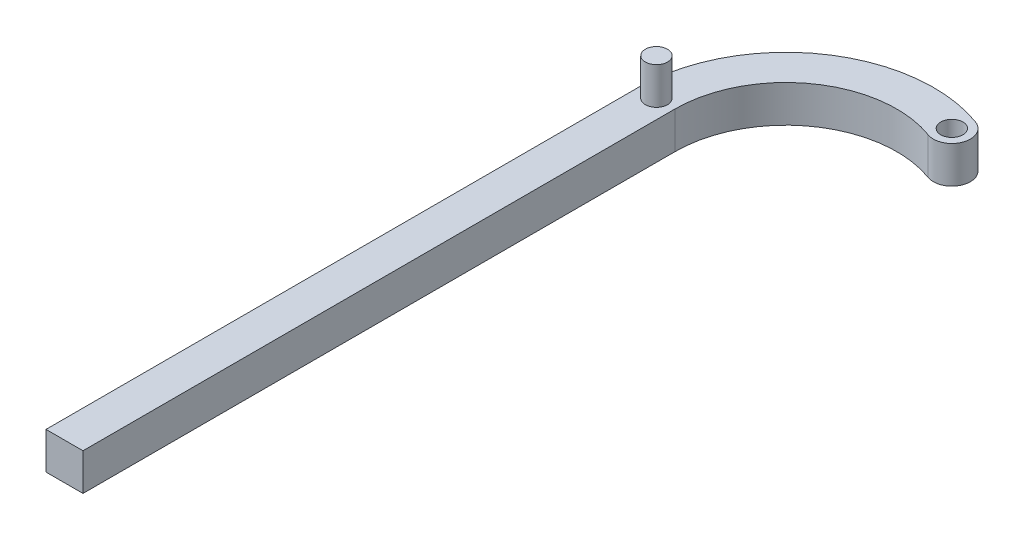
ISO-10303-21;
HEADER;
FILE_DESCRIPTION(('STEP AP214'),'2;1');
FILE_NAME('part.step','',(''),(''),'','','');
FILE_SCHEMA(('AUTOMOTIVE_DESIGN { 1 0 10303 214 1 1 1 1 }'));
ENDSEC;
DATA;
#1=APPLICATION_CONTEXT('core data for automotive mechanical design processes');
#2=APPLICATION_PROTOCOL_DEFINITION('international standard','automotive_design',2000,#1);
#3=PRODUCT_CONTEXT('',#1,'mechanical');
#4=PRODUCT('Part','Part','',(#3));
#5=PRODUCT_RELATED_PRODUCT_CATEGORY('part','',(#4));
#6=PRODUCT_DEFINITION_FORMATION('','',#4);
#7=PRODUCT_DEFINITION_CONTEXT('part definition',#1,'design');
#8=PRODUCT_DEFINITION('design','',#6,#7);
#9=PRODUCT_DEFINITION_SHAPE('','',#8);
#10=(LENGTH_UNIT() NAMED_UNIT(*) SI_UNIT(.MILLI.,.METRE.));
#11=(NAMED_UNIT(*) PLANE_ANGLE_UNIT() SI_UNIT($,.RADIAN.));
#12=(NAMED_UNIT(*) SI_UNIT($,.STERADIAN.) SOLID_ANGLE_UNIT());
#13=UNCERTAINTY_MEASURE_WITH_UNIT(LENGTH_MEASURE(1.E-05),#10,'distance_accuracy_value','');
#14=(GEOMETRIC_REPRESENTATION_CONTEXT(3) GLOBAL_UNCERTAINTY_ASSIGNED_CONTEXT((#13)) GLOBAL_UNIT_ASSIGNED_CONTEXT((#10,
#11,#12)) REPRESENTATION_CONTEXT('',''));
#15=CARTESIAN_POINT('',(0.,0.,0.));
#16=DIRECTION('',(0.,0.,1.));
#17=DIRECTION('',(1.,0.,0.));
#18=AXIS2_PLACEMENT_3D('',#15,#16,#17);
#19=CARTESIAN_POINT('',(0.,5.,0.));
#20=DIRECTION('',(0.,1.,0.));
#21=DIRECTION('',(0.,0.,1.));
#22=AXIS2_PLACEMENT_3D('',#19,#20,#21);
#23=PLANE('',#22);
#24=CARTESIAN_POINT('',(0.,5.,0.));
#25=DIRECTION('',(0.,1.,0.));
#26=DIRECTION('',(0.,0.,1.));
#27=AXIS2_PLACEMENT_3D('',#24,#25,#26);
#28=CIRCLE('',#27,15.);
#29=CARTESIAN_POINT('',(5.13030214988509,5.,-14.0953893117886));
#30=VERTEX_POINT('',#29);
#31=CARTESIAN_POINT('',(-15.,5.,0.));
#32=VERTEX_POINT('',#31);
#33=EDGE_CURVE('E89',#30,#32,#28,.T.);
#34=ORIENTED_EDGE('',*,*,#33,.F.);
#35=CARTESIAN_POINT('',(5.98535250819927,5.,-16.4446208637534));
#36=DIRECTION('',(0.,1.,0.));
#37=DIRECTION('',(0.,0.,1.));
#38=AXIS2_PLACEMENT_3D('',#35,#36,#37);
#39=CIRCLE('',#38,2.5);
#40=CARTESIAN_POINT('',(6.84040286651345,5.,-18.7938524157181));
#41=VERTEX_POINT('',#40);
#42=EDGE_CURVE('E92',#30,#41,#39,.T.);
#43=ORIENTED_EDGE('',*,*,#42,.T.);
#44=CARTESIAN_POINT('',(0.,5.,0.));
#45=DIRECTION('',(0.,1.,0.));
#46=DIRECTION('',(0.,0.,1.));
#47=AXIS2_PLACEMENT_3D('',#44,#45,#46);
#48=CIRCLE('',#47,20.);
#49=CARTESIAN_POINT('',(-20.,5.,0.));
#50=VERTEX_POINT('',#49);
#51=EDGE_CURVE('E11',#41,#50,#48,.T.);
#52=ORIENTED_EDGE('',*,*,#51,.T.);
#53=DIRECTION('',(0.,0.,-1.));
#54=VECTOR('',#53,1.);
#55=CARTESIAN_POINT('',(-20.,5.,80.));
#56=LINE('',#55,#54);
#57=CARTESIAN_POINT('',(-20.,5.,80.));
#58=VERTEX_POINT('',#57);
#59=EDGE_CURVE('E124',#58,#50,#56,.T.);
#60=ORIENTED_EDGE('',*,*,#59,.F.);
#61=DIRECTION('',(-1.,0.,0.));
#62=VECTOR('',#61,1.);
#63=CARTESIAN_POINT('',(-15.,5.,80.));
#64=LINE('',#63,#62);
#65=CARTESIAN_POINT('',(-15.,5.,80.));
#66=VERTEX_POINT('',#65);
#67=EDGE_CURVE('E107',#66,#58,#64,.T.);
#68=ORIENTED_EDGE('',*,*,#67,.F.);
#69=DIRECTION('',(0.,0.,1.));
#70=VECTOR('',#69,1.);
#71=CARTESIAN_POINT('',(-15.,5.,0.));
#72=LINE('',#71,#70);
#73=EDGE_CURVE('E94',#32,#66,#72,.T.);
#74=ORIENTED_EDGE('',*,*,#73,.F.);
#75=EDGE_LOOP('',(#34,#43,#52,#60,#68,#74));
#76=FACE_BOUND('',#75,.T.);
#77=CARTESIAN_POINT('',(5.98535250819927,5.,-16.4446208637534));
#78=DIRECTION('',(0.,1.,0.));
#79=DIRECTION('',(0.,0.,1.));
#80=AXIS2_PLACEMENT_3D('',#77,#78,#79);
#81=CIRCLE('',#80,1.5);
#82=CARTESIAN_POINT('',(5.98535250819927,5.,-14.9446208637534));
#83=VERTEX_POINT('',#82);
#84=EDGE_CURVE('E110',#83,#83,#81,.T.);
#85=ORIENTED_EDGE('',*,*,#84,.F.);
#86=EDGE_LOOP('',(#85));
#87=FACE_BOUND('',#86,.T.);
#88=CARTESIAN_POINT('',(-17.5,5.,0.));
#89=DIRECTION('',(0.,1.,0.));
#90=DIRECTION('',(0.,0.,1.));
#91=AXIS2_PLACEMENT_3D('',#88,#89,#90);
#92=CIRCLE('',#91,1.5);
#93=CARTESIAN_POINT('',(-17.5,5.,1.5));
#94=VERTEX_POINT('',#93);
#95=EDGE_CURVE('E186',#94,#94,#92,.T.);
#96=ORIENTED_EDGE('',*,*,#95,.F.);
#97=EDGE_LOOP('',(#96));
#98=FACE_BOUND('',#97,.T.);
#99=ADVANCED_FACE('F33',(#76,#87,#98),#23,.T.);
#100=CARTESIAN_POINT('',(0.,5.,0.));
#101=DIRECTION('',(0.,-1.,0.));
#102=DIRECTION('',(0.,0.,-1.));
#103=AXIS2_PLACEMENT_3D('',#100,#101,#102);
#104=CYLINDRICAL_SURFACE('',#103,20.);
#105=ORIENTED_EDGE('',*,*,#51,.F.);
#106=DIRECTION('',(0.,1.,0.));
#107=VECTOR('',#106,1.);
#108=CARTESIAN_POINT('',(6.84040286651345,0.,-18.7938524157181));
#109=LINE('',#108,#107);
#110=CARTESIAN_POINT('',(6.84040286651345,0.,-18.7938524157181));
#111=VERTEX_POINT('',#110);
#112=EDGE_CURVE('E101',#111,#41,#109,.T.);
#113=ORIENTED_EDGE('',*,*,#112,.F.);
#114=CARTESIAN_POINT('',(0.,0.,0.));
#115=DIRECTION('',(0.,1.,0.));
#116=DIRECTION('',(0.,0.,1.));
#117=AXIS2_PLACEMENT_3D('',#114,#115,#116);
#118=CIRCLE('',#117,20.);
#119=CARTESIAN_POINT('',(-20.,0.,0.));
#120=VERTEX_POINT('',#119);
#121=EDGE_CURVE('E37',#111,#120,#118,.T.);
#122=ORIENTED_EDGE('',*,*,#121,.T.);
#123=DIRECTION('',(0.,1.,0.));
#124=VECTOR('',#123,1.);
#125=CARTESIAN_POINT('',(-20.,0.,0.));
#126=LINE('',#125,#124);
#127=EDGE_CURVE('E134',#120,#50,#126,.T.);
#128=ORIENTED_EDGE('',*,*,#127,.T.);
#129=EDGE_LOOP('',(#105,#113,#122,#128));
#130=FACE_BOUND('',#129,.T.);
#131=ADVANCED_FACE('F35',(#130),#104,.T.);
#132=CARTESIAN_POINT('',(0.,0.,0.));
#133=DIRECTION('',(0.,1.,0.));
#134=DIRECTION('',(0.,0.,1.));
#135=AXIS2_PLACEMENT_3D('',#132,#133,#134);
#136=PLANE('',#135);
#137=CARTESIAN_POINT('',(5.98535250819927,0.,-16.4446208637534));
#138=DIRECTION('',(0.,1.,0.));
#139=DIRECTION('',(0.,0.,1.));
#140=AXIS2_PLACEMENT_3D('',#137,#138,#139);
#141=CIRCLE('',#140,1.5);
#142=CARTESIAN_POINT('',(5.98535250819927,0.,-14.9446208637534));
#143=VERTEX_POINT('',#142);
#144=EDGE_CURVE('E105',#143,#143,#141,.T.);
#145=ORIENTED_EDGE('',*,*,#144,.T.);
#146=EDGE_LOOP('',(#145));
#147=FACE_BOUND('',#146,.T.);
#148=ORIENTED_EDGE('',*,*,#121,.F.);
#149=CARTESIAN_POINT('',(5.98535250819927,0.,-16.4446208637534));
#150=DIRECTION('',(0.,1.,0.));
#151=DIRECTION('',(0.,0.,1.));
#152=AXIS2_PLACEMENT_3D('',#149,#150,#151);
#153=CIRCLE('',#152,2.5);
#154=CARTESIAN_POINT('',(5.13030214988509,0.,-14.0953893117886));
#155=VERTEX_POINT('',#154);
#156=EDGE_CURVE('E104',#155,#111,#153,.T.);
#157=ORIENTED_EDGE('',*,*,#156,.F.);
#158=CARTESIAN_POINT('',(0.,0.,0.));
#159=DIRECTION('',(0.,1.,0.));
#160=DIRECTION('',(0.,0.,1.));
#161=AXIS2_PLACEMENT_3D('',#158,#159,#160);
#162=CIRCLE('',#161,15.);
#163=CARTESIAN_POINT('',(-15.,0.,0.));
#164=VERTEX_POINT('',#163);
#165=EDGE_CURVE('E53',#155,#164,#162,.T.);
#166=ORIENTED_EDGE('',*,*,#165,.T.);
#167=DIRECTION('',(0.,0.,1.));
#168=VECTOR('',#167,1.);
#169=CARTESIAN_POINT('',(-15.,0.,0.));
#170=LINE('',#169,#168);
#171=CARTESIAN_POINT('',(-15.,0.,80.));
#172=VERTEX_POINT('',#171);
#173=EDGE_CURVE('E119',#164,#172,#170,.T.);
#174=ORIENTED_EDGE('',*,*,#173,.T.);
#175=DIRECTION('',(-1.,0.,0.));
#176=VECTOR('',#175,1.);
#177=CARTESIAN_POINT('',(-15.,0.,80.));
#178=LINE('',#177,#176);
#179=CARTESIAN_POINT('',(-20.,0.,80.));
#180=VERTEX_POINT('',#179);
#181=EDGE_CURVE('E114',#172,#180,#178,.T.);
#182=ORIENTED_EDGE('',*,*,#181,.T.);
#183=DIRECTION('',(0.,0.,-1.));
#184=VECTOR('',#183,1.);
#185=CARTESIAN_POINT('',(-20.,0.,80.));
#186=LINE('',#185,#184);
#187=EDGE_CURVE('E117',#180,#120,#186,.T.);
#188=ORIENTED_EDGE('',*,*,#187,.T.);
#189=EDGE_LOOP('',(#148,#157,#166,#174,#182,#188));
#190=FACE_BOUND('',#189,.T.);
#191=ADVANCED_FACE('F139',(#147,#190),#136,.F.);
#192=CARTESIAN_POINT('',(0.,0.,0.));
#193=DIRECTION('',(0.,1.,0.));
#194=DIRECTION('',(0.,0.,1.));
#195=AXIS2_PLACEMENT_3D('',#192,#193,#194);
#196=CYLINDRICAL_SURFACE('',#195,15.);
#197=ORIENTED_EDGE('',*,*,#165,.F.);
#198=DIRECTION('',(0.,1.,0.));
#199=VECTOR('',#198,1.);
#200=CARTESIAN_POINT('',(5.13030214988509,0.,-14.0953893117886));
#201=LINE('',#200,#199);
#202=EDGE_CURVE('E95',#155,#30,#201,.T.);
#203=ORIENTED_EDGE('',*,*,#202,.T.);
#204=ORIENTED_EDGE('',*,*,#33,.T.);
#205=DIRECTION('',(0.,1.,0.));
#206=VECTOR('',#205,1.);
#207=CARTESIAN_POINT('',(-15.,0.,0.));
#208=LINE('',#207,#206);
#209=EDGE_CURVE('E48',#164,#32,#208,.T.);
#210=ORIENTED_EDGE('',*,*,#209,.F.);
#211=EDGE_LOOP('',(#197,#203,#204,#210));
#212=FACE_BOUND('',#211,.T.);
#213=ADVANCED_FACE('F97',(#212),#196,.F.);
#214=CARTESIAN_POINT('',(-15.,0.,80.));
#215=DIRECTION('',(0.,0.,-1.));
#216=DIRECTION('',(-1.,0.,0.));
#217=AXIS2_PLACEMENT_3D('',#214,#215,#216);
#218=PLANE('',#217);
#219=ORIENTED_EDGE('',*,*,#67,.T.);
#220=DIRECTION('',(0.,1.,0.));
#221=VECTOR('',#220,1.);
#222=CARTESIAN_POINT('',(-20.,0.,80.));
#223=LINE('',#222,#221);
#224=EDGE_CURVE('E130',#180,#58,#223,.T.);
#225=ORIENTED_EDGE('',*,*,#224,.F.);
#226=ORIENTED_EDGE('',*,*,#181,.F.);
#227=DIRECTION('',(0.,1.,0.));
#228=VECTOR('',#227,1.);
#229=CARTESIAN_POINT('',(-15.,0.,80.));
#230=LINE('',#229,#228);
#231=EDGE_CURVE('E121',#172,#66,#230,.T.);
#232=ORIENTED_EDGE('',*,*,#231,.T.);
#233=EDGE_LOOP('',(#219,#225,#226,#232));
#234=FACE_BOUND('',#233,.T.);
#235=ADVANCED_FACE('F146',(#234),#218,.F.);
#236=CARTESIAN_POINT('',(-20.,0.,80.));
#237=DIRECTION('',(1.,0.,0.));
#238=DIRECTION('',(0.,0.,-1.));
#239=AXIS2_PLACEMENT_3D('',#236,#237,#238);
#240=PLANE('',#239);
#241=ORIENTED_EDGE('',*,*,#59,.T.);
#242=ORIENTED_EDGE('',*,*,#127,.F.);
#243=ORIENTED_EDGE('',*,*,#187,.F.);
#244=ORIENTED_EDGE('',*,*,#224,.T.);
#245=EDGE_LOOP('',(#241,#242,#243,#244));
#246=FACE_BOUND('',#245,.T.);
#247=ADVANCED_FACE('F149',(#246),#240,.F.);
#248=CARTESIAN_POINT('',(-15.,0.,0.));
#249=DIRECTION('',(-1.,0.,0.));
#250=DIRECTION('',(0.,0.,1.));
#251=AXIS2_PLACEMENT_3D('',#248,#249,#250);
#252=PLANE('',#251);
#253=ORIENTED_EDGE('',*,*,#73,.T.);
#254=ORIENTED_EDGE('',*,*,#231,.F.);
#255=ORIENTED_EDGE('',*,*,#173,.F.);
#256=ORIENTED_EDGE('',*,*,#209,.T.);
#257=EDGE_LOOP('',(#253,#254,#255,#256));
#258=FACE_BOUND('',#257,.T.);
#259=ADVANCED_FACE('F142',(#258),#252,.F.);
#260=CARTESIAN_POINT('',(5.98535250819927,0.,-16.4446208637534));
#261=DIRECTION('',(0.,1.,0.));
#262=DIRECTION('',(0.,0.,1.));
#263=AXIS2_PLACEMENT_3D('',#260,#261,#262);
#264=CYLINDRICAL_SURFACE('',#263,2.5);
#265=ORIENTED_EDGE('',*,*,#42,.F.);
#266=ORIENTED_EDGE('',*,*,#202,.F.);
#267=ORIENTED_EDGE('',*,*,#156,.T.);
#268=ORIENTED_EDGE('',*,*,#112,.T.);
#269=EDGE_LOOP('',(#265,#266,#267,#268));
#270=FACE_BOUND('',#269,.T.);
#271=ADVANCED_FACE('F103',(#270),#264,.T.);
#272=CARTESIAN_POINT('',(5.98535250819927,0.,-16.4446208637534));
#273=DIRECTION('',(0.,1.,0.));
#274=DIRECTION('',(0.,0.,1.));
#275=AXIS2_PLACEMENT_3D('',#272,#273,#274);
#276=CYLINDRICAL_SURFACE('',#275,1.5);
#277=ORIENTED_EDGE('',*,*,#144,.F.);
#278=EDGE_LOOP('',(#277));
#279=FACE_BOUND('',#278,.T.);
#280=ORIENTED_EDGE('',*,*,#84,.T.);
#281=EDGE_LOOP('',(#280));
#282=FACE_BOUND('',#281,.T.);
#283=ADVANCED_FACE('F170',(#279,#282),#276,.F.);
#284=CARTESIAN_POINT('',(-17.5,10.,0.));
#285=DIRECTION('',(0.,-1.,0.));
#286=DIRECTION('',(0.,0.,-1.));
#287=AXIS2_PLACEMENT_3D('',#284,#285,#286);
#288=CYLINDRICAL_SURFACE('',#287,1.5);
#289=CARTESIAN_POINT('',(-17.5,10.,0.));
#290=DIRECTION('',(0.,1.,0.));
#291=DIRECTION('',(0.,0.,1.));
#292=AXIS2_PLACEMENT_3D('',#289,#290,#291);
#293=CIRCLE('',#292,1.5);
#294=CARTESIAN_POINT('',(-17.5,10.,1.5));
#295=VERTEX_POINT('',#294);
#296=EDGE_CURVE('E185',#295,#295,#293,.T.);
#297=ORIENTED_EDGE('',*,*,#296,.F.);
#298=EDGE_LOOP('',(#297));
#299=FACE_BOUND('',#298,.T.);
#300=ORIENTED_EDGE('',*,*,#95,.T.);
#301=EDGE_LOOP('',(#300));
#302=FACE_BOUND('',#301,.T.);
#303=ADVANCED_FACE('F173',(#299,#302),#288,.T.);
#304=CARTESIAN_POINT('',(-17.5,10.,0.));
#305=DIRECTION('',(0.,1.,0.));
#306=DIRECTION('',(0.,0.,1.));
#307=AXIS2_PLACEMENT_3D('',#304,#305,#306);
#308=PLANE('',#307);
#309=ORIENTED_EDGE('',*,*,#296,.T.);
#310=EDGE_LOOP('',(#309));
#311=FACE_BOUND('',#310,.T.);
#312=ADVANCED_FACE('F177',(#311),#308,.T.);
#313=CLOSED_SHELL('',(#99,#131,#191,#213,#235,#247,#259,#271,#283,#303,#312));
#314=MANIFOLD_SOLID_BREP('B2',#313);
#315=ADVANCED_BREP_SHAPE_REPRESENTATION('',(#18,#314),#14);
#316=SHAPE_DEFINITION_REPRESENTATION(#9,#315);
ENDSEC;
END-ISO-10303-21;
